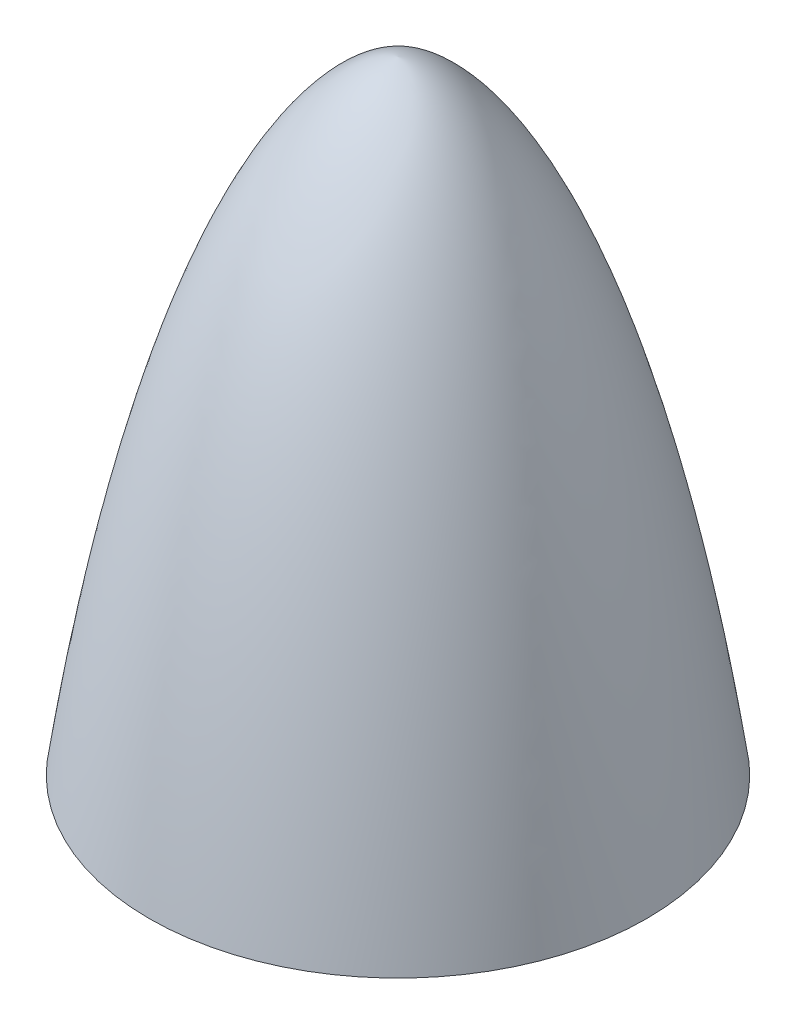
ISO-10303-21;
HEADER;
FILE_DESCRIPTION(('STEP AP214'),'2;1');
FILE_NAME('part.step','',(''),(''),'','','');
FILE_SCHEMA(('AUTOMOTIVE_DESIGN { 1 0 10303 214 1 1 1 1 }'));
ENDSEC;
DATA;
#1=APPLICATION_CONTEXT('core data for automotive mechanical design processes');
#2=APPLICATION_PROTOCOL_DEFINITION('international standard','automotive_design',2000,#1);
#3=PRODUCT_CONTEXT('',#1,'mechanical');
#4=PRODUCT('Part','Part','',(#3));
#5=PRODUCT_RELATED_PRODUCT_CATEGORY('part','',(#4));
#6=PRODUCT_DEFINITION_FORMATION('','',#4);
#7=PRODUCT_DEFINITION_CONTEXT('part definition',#1,'design');
#8=PRODUCT_DEFINITION('design','',#6,#7);
#9=PRODUCT_DEFINITION_SHAPE('','',#8);
#10=(LENGTH_UNIT() NAMED_UNIT(*) SI_UNIT(.MILLI.,.METRE.));
#11=(NAMED_UNIT(*) PLANE_ANGLE_UNIT() SI_UNIT($,.RADIAN.));
#12=(NAMED_UNIT(*) SI_UNIT($,.STERADIAN.) SOLID_ANGLE_UNIT());
#13=UNCERTAINTY_MEASURE_WITH_UNIT(LENGTH_MEASURE(1.E-05),#10,'distance_accuracy_value','');
#14=(GEOMETRIC_REPRESENTATION_CONTEXT(3) GLOBAL_UNCERTAINTY_ASSIGNED_CONTEXT((#13)) GLOBAL_UNIT_ASSIGNED_CONTEXT((#10,
#11,#12)) REPRESENTATION_CONTEXT('',''));
#15=CARTESIAN_POINT('',(0.,0.,0.));
#16=DIRECTION('',(0.,0.,1.));
#17=DIRECTION('',(1.,0.,0.));
#18=AXIS2_PLACEMENT_3D('',#15,#16,#17);
#19=CARTESIAN_POINT('',(0.,0.,0.));
#20=DIRECTION('',(0.,1.,0.));
#21=DIRECTION('',(0.,0.,1.));
#22=AXIS2_PLACEMENT_3D('',#19,#20,#21);
#23=PLANE('',#22);
#24=CARTESIAN_POINT('',(0.,0.,0.));
#25=DIRECTION('',(0.,1.,0.));
#26=DIRECTION('',(0.,0.,1.));
#27=AXIS2_PLACEMENT_3D('',#24,#25,#26);
#28=CIRCLE('',#27,254.);
#29=CARTESIAN_POINT('',(0.,0.,254.));
#30=VERTEX_POINT('',#29);
#31=EDGE_CURVE('E11',#30,#30,#28,.T.);
#32=ORIENTED_EDGE('',*,*,#31,.F.);
#33=EDGE_LOOP('',(#32));
#34=FACE_BOUND('',#33,.T.);
#35=ADVANCED_FACE('F37',(#34),#23,.F.);
#36=CARTESIAN_POINT('',(254.,0.,0.));
#37=CARTESIAN_POINT('',(184.95329260719,483.383268853899,0.));
#38=CARTESIAN_POINT('',(69.1657301295117,624.460149905181,0.));
#39=CARTESIAN_POINT('',(0.,635.,0.));
#40=B_SPLINE_CURVE_WITH_KNOTS('',3,(#36,#37,#38,#39),.UNSPECIFIED.,.F.,.F.,(4,4),(0.,1.),.UNSPECIFIED.);
#41=CARTESIAN_POINT('',(0.,635.,0.));
#42=DIRECTION('',(0.,1.,0.));
#43=AXIS1_PLACEMENT('',#41,#42);
#44=SURFACE_OF_REVOLUTION('',#40,#43);
#45=CARTESIAN_POINT('',(0.,635.,0.));
#46=VERTEX_POINT('',#45);
#47=VERTEX_LOOP('',#46);
#48=FACE_BOUND('',#47,.T.);
#49=ORIENTED_EDGE('',*,*,#31,.T.);
#50=EDGE_LOOP('',(#49));
#51=FACE_BOUND('',#50,.T.);
#52=ADVANCED_FACE('F45',(#48,#51),#44,.T.);
#53=CLOSED_SHELL('',(#35,#52));
#54=MANIFOLD_SOLID_BREP('B2',#53);
#55=ADVANCED_BREP_SHAPE_REPRESENTATION('',(#18,#54),#14);
#56=SHAPE_DEFINITION_REPRESENTATION(#9,#55);
ENDSEC;
END-ISO-10303-21;
